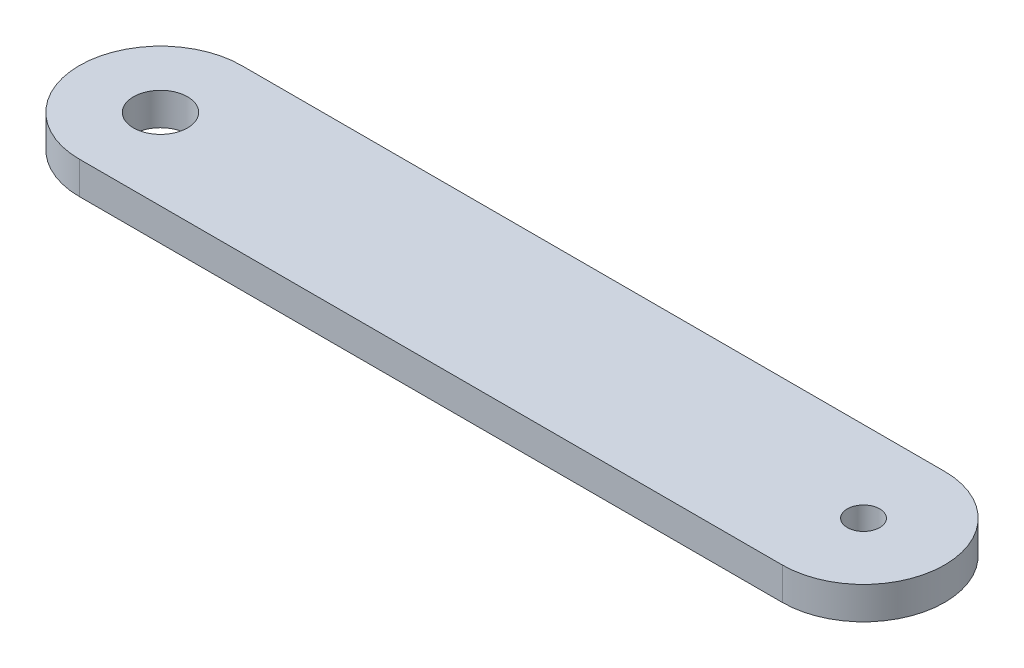
ISO-10303-21;
HEADER;
FILE_DESCRIPTION(('STEP AP214'),'2;1');
FILE_NAME('part.step','',(''),(''),'','','');
FILE_SCHEMA(('AUTOMOTIVE_DESIGN { 1 0 10303 214 1 1 1 1 }'));
ENDSEC;
DATA;
#1=APPLICATION_CONTEXT('core data for automotive mechanical design processes');
#2=APPLICATION_PROTOCOL_DEFINITION('international standard','automotive_design',2000,#1);
#3=PRODUCT_CONTEXT('',#1,'mechanical');
#4=PRODUCT('Part','Part','',(#3));
#5=PRODUCT_RELATED_PRODUCT_CATEGORY('part','',(#4));
#6=PRODUCT_DEFINITION_FORMATION('','',#4);
#7=PRODUCT_DEFINITION_CONTEXT('part definition',#1,'design');
#8=PRODUCT_DEFINITION('design','',#6,#7);
#9=PRODUCT_DEFINITION_SHAPE('','',#8);
#10=(LENGTH_UNIT() NAMED_UNIT(*) SI_UNIT(.MILLI.,.METRE.));
#11=(NAMED_UNIT(*) PLANE_ANGLE_UNIT() SI_UNIT($,.RADIAN.));
#12=(NAMED_UNIT(*) SI_UNIT($,.STERADIAN.) SOLID_ANGLE_UNIT());
#13=UNCERTAINTY_MEASURE_WITH_UNIT(LENGTH_MEASURE(1.E-05),#10,'distance_accuracy_value','');
#14=(GEOMETRIC_REPRESENTATION_CONTEXT(3) GLOBAL_UNCERTAINTY_ASSIGNED_CONTEXT((#13)) GLOBAL_UNIT_ASSIGNED_CONTEXT((#10,
#11,#12)) REPRESENTATION_CONTEXT('',''));
#15=CARTESIAN_POINT('',(0.,0.,0.));
#16=DIRECTION('',(0.,0.,1.));
#17=DIRECTION('',(1.,0.,0.));
#18=AXIS2_PLACEMENT_3D('',#15,#16,#17);
#19=CARTESIAN_POINT('',(123.5,6.,-13.5000000000001));
#20=DIRECTION('',(0.,1.,0.));
#21=DIRECTION('',(0.,0.,1.));
#22=AXIS2_PLACEMENT_3D('',#19,#20,#21);
#23=PLANE('',#22);
#24=CARTESIAN_POINT('',(-6.50000000000001,6.,-13.5));
#25=DIRECTION('',(0.,1.,0.));
#26=DIRECTION('',(0.,0.,1.));
#27=AXIS2_PLACEMENT_3D('',#24,#25,#26);
#28=CIRCLE('',#27,5.);
#29=CARTESIAN_POINT('',(-6.50000000000001,6.,-8.5));
#30=VERTEX_POINT('',#29);
#31=EDGE_CURVE('E112',#30,#30,#28,.T.);
#32=ORIENTED_EDGE('',*,*,#31,.F.);
#33=EDGE_LOOP('',(#32));
#34=FACE_BOUND('',#33,.T.);
#35=CARTESIAN_POINT('',(123.5,6.,-13.5000000000001));
#36=DIRECTION('',(0.,1.,0.));
#37=DIRECTION('',(0.,0.,1.));
#38=AXIS2_PLACEMENT_3D('',#35,#36,#37);
#39=CIRCLE('',#38,15.);
#40=CARTESIAN_POINT('',(123.5,6.,1.49999999999992));
#41=VERTEX_POINT('',#40);
#42=CARTESIAN_POINT('',(123.5,6.,-28.5000000000001));
#43=VERTEX_POINT('',#42);
#44=EDGE_CURVE('E92',#41,#43,#39,.T.);
#45=ORIENTED_EDGE('',*,*,#44,.T.);
#46=DIRECTION('',(-1.,0.,0.));
#47=VECTOR('',#46,1.);
#48=CARTESIAN_POINT('',(-6.50000000000001,6.,-28.5));
#49=LINE('',#48,#47);
#50=CARTESIAN_POINT('',(-6.50000000000001,6.,-28.5));
#51=VERTEX_POINT('',#50);
#52=EDGE_CURVE('E87',#43,#51,#49,.T.);
#53=ORIENTED_EDGE('',*,*,#52,.T.);
#54=CARTESIAN_POINT('',(-6.50000000000001,6.,-13.5));
#55=DIRECTION('',(0.,1.,0.));
#56=DIRECTION('',(0.,0.,1.));
#57=AXIS2_PLACEMENT_3D('',#54,#55,#56);
#58=CIRCLE('',#57,15.);
#59=CARTESIAN_POINT('',(-6.5,6.,1.5));
#60=VERTEX_POINT('',#59);
#61=EDGE_CURVE('E90',#51,#60,#58,.T.);
#62=ORIENTED_EDGE('',*,*,#61,.T.);
#63=DIRECTION('',(1.,0.,0.));
#64=VECTOR('',#63,1.);
#65=CARTESIAN_POINT('',(-6.5,6.,1.5));
#66=LINE('',#65,#64);
#67=EDGE_CURVE('E57',#60,#41,#66,.T.);
#68=ORIENTED_EDGE('',*,*,#67,.T.);
#69=EDGE_LOOP('',(#45,#53,#62,#68));
#70=FACE_BOUND('',#69,.T.);
#71=CARTESIAN_POINT('',(123.5,6.,-13.5000000000001));
#72=DIRECTION('',(0.,1.,0.));
#73=DIRECTION('',(0.,0.,1.));
#74=AXIS2_PLACEMENT_3D('',#71,#72,#73);
#75=CIRCLE('',#74,2.99999999999998);
#76=CARTESIAN_POINT('',(123.5,6.,-10.5000000000001));
#77=VERTEX_POINT('',#76);
#78=EDGE_CURVE('E134',#77,#77,#75,.T.);
#79=ORIENTED_EDGE('',*,*,#78,.F.);
#80=EDGE_LOOP('',(#79));
#81=FACE_BOUND('',#80,.T.);
#82=ADVANCED_FACE('F39',(#34,#70,#81),#23,.T.);
#83=CARTESIAN_POINT('',(123.5,0.,-13.5000000000001));
#84=DIRECTION('',(0.,1.,0.));
#85=DIRECTION('',(0.,0.,1.));
#86=AXIS2_PLACEMENT_3D('',#83,#84,#85);
#87=PLANE('',#86);
#88=CARTESIAN_POINT('',(123.5,0.,-13.5000000000001));
#89=DIRECTION('',(0.,1.,0.));
#90=DIRECTION('',(0.,0.,1.));
#91=AXIS2_PLACEMENT_3D('',#88,#89,#90);
#92=CIRCLE('',#91,15.);
#93=CARTESIAN_POINT('',(123.5,0.,1.49999999999992));
#94=VERTEX_POINT('',#93);
#95=CARTESIAN_POINT('',(123.5,0.,-28.5000000000001));
#96=VERTEX_POINT('',#95);
#97=EDGE_CURVE('E108',#94,#96,#92,.T.);
#98=ORIENTED_EDGE('',*,*,#97,.F.);
#99=DIRECTION('',(1.,0.,0.));
#100=VECTOR('',#99,1.);
#101=CARTESIAN_POINT('',(-6.5,0.,1.5));
#102=LINE('',#101,#100);
#103=CARTESIAN_POINT('',(-6.5,0.,1.5));
#104=VERTEX_POINT('',#103);
#105=EDGE_CURVE('E80',#104,#94,#102,.T.);
#106=ORIENTED_EDGE('',*,*,#105,.F.);
#107=CARTESIAN_POINT('',(-6.50000000000001,0.,-13.5));
#108=DIRECTION('',(0.,1.,0.));
#109=DIRECTION('',(0.,0.,1.));
#110=AXIS2_PLACEMENT_3D('',#107,#108,#109);
#111=CIRCLE('',#110,15.);
#112=CARTESIAN_POINT('',(-6.50000000000001,0.,-28.5));
#113=VERTEX_POINT('',#112);
#114=EDGE_CURVE('E74',#113,#104,#111,.T.);
#115=ORIENTED_EDGE('',*,*,#114,.F.);
#116=DIRECTION('',(-1.,0.,0.));
#117=VECTOR('',#116,1.);
#118=CARTESIAN_POINT('',(-6.50000000000001,0.,-28.5));
#119=LINE('',#118,#117);
#120=EDGE_CURVE('E97',#96,#113,#119,.T.);
#121=ORIENTED_EDGE('',*,*,#120,.F.);
#122=EDGE_LOOP('',(#98,#106,#115,#121));
#123=FACE_BOUND('',#122,.T.);
#124=CARTESIAN_POINT('',(-6.50000000000001,0.,-13.5));
#125=DIRECTION('',(0.,1.,0.));
#126=DIRECTION('',(0.,0.,1.));
#127=AXIS2_PLACEMENT_3D('',#124,#125,#126);
#128=CIRCLE('',#127,5.);
#129=CARTESIAN_POINT('',(-6.50000000000001,0.,-8.5));
#130=VERTEX_POINT('',#129);
#131=EDGE_CURVE('E130',#130,#130,#128,.T.);
#132=ORIENTED_EDGE('',*,*,#131,.T.);
#133=EDGE_LOOP('',(#132));
#134=FACE_BOUND('',#133,.T.);
#135=CARTESIAN_POINT('',(123.5,0.,-13.5000000000001));
#136=DIRECTION('',(0.,1.,0.));
#137=DIRECTION('',(0.,0.,1.));
#138=AXIS2_PLACEMENT_3D('',#135,#136,#137);
#139=CIRCLE('',#138,2.99999999999998);
#140=CARTESIAN_POINT('',(123.5,0.,-10.5000000000001));
#141=VERTEX_POINT('',#140);
#142=EDGE_CURVE('E138',#141,#141,#139,.T.);
#143=ORIENTED_EDGE('',*,*,#142,.T.);
#144=EDGE_LOOP('',(#143));
#145=FACE_BOUND('',#144,.T.);
#146=ADVANCED_FACE('F125',(#123,#134,#145),#87,.F.);
#147=CARTESIAN_POINT('',(123.5,6.,-13.5000000000001));
#148=DIRECTION('',(0.,-1.,0.));
#149=DIRECTION('',(0.,0.,-1.));
#150=AXIS2_PLACEMENT_3D('',#147,#148,#149);
#151=CYLINDRICAL_SURFACE('',#150,15.);
#152=ORIENTED_EDGE('',*,*,#97,.T.);
#153=DIRECTION('',(0.,-1.,0.));
#154=VECTOR('',#153,1.);
#155=CARTESIAN_POINT('',(123.5,6.,-28.5000000000001));
#156=LINE('',#155,#154);
#157=EDGE_CURVE('E11',#43,#96,#156,.T.);
#158=ORIENTED_EDGE('',*,*,#157,.F.);
#159=ORIENTED_EDGE('',*,*,#44,.F.);
#160=DIRECTION('',(0.,-1.,0.));
#161=VECTOR('',#160,1.);
#162=CARTESIAN_POINT('',(123.5,6.,1.49999999999992));
#163=LINE('',#162,#161);
#164=EDGE_CURVE('E104',#41,#94,#163,.T.);
#165=ORIENTED_EDGE('',*,*,#164,.T.);
#166=EDGE_LOOP('',(#152,#158,#159,#165));
#167=FACE_BOUND('',#166,.T.);
#168=ADVANCED_FACE('F41',(#167),#151,.T.);
#169=CARTESIAN_POINT('',(-6.50000000000001,6.,-28.5));
#170=DIRECTION('',(0.,0.,1.));
#171=DIRECTION('',(1.,0.,0.));
#172=AXIS2_PLACEMENT_3D('',#169,#170,#171);
#173=PLANE('',#172);
#174=ORIENTED_EDGE('',*,*,#120,.T.);
#175=DIRECTION('',(0.,-1.,0.));
#176=VECTOR('',#175,1.);
#177=CARTESIAN_POINT('',(-6.50000000000001,6.,-28.5));
#178=LINE('',#177,#176);
#179=EDGE_CURVE('E49',#51,#113,#178,.T.);
#180=ORIENTED_EDGE('',*,*,#179,.F.);
#181=ORIENTED_EDGE('',*,*,#52,.F.);
#182=ORIENTED_EDGE('',*,*,#157,.T.);
#183=EDGE_LOOP('',(#174,#180,#181,#182));
#184=FACE_BOUND('',#183,.T.);
#185=ADVANCED_FACE('F96',(#184),#173,.F.);
#186=CARTESIAN_POINT('',(-6.50000000000001,6.,-13.5));
#187=DIRECTION('',(0.,-1.,0.));
#188=DIRECTION('',(0.,0.,-1.));
#189=AXIS2_PLACEMENT_3D('',#186,#187,#188);
#190=CYLINDRICAL_SURFACE('',#189,15.);
#191=ORIENTED_EDGE('',*,*,#114,.T.);
#192=DIRECTION('',(0.,-1.,0.));
#193=VECTOR('',#192,1.);
#194=CARTESIAN_POINT('',(-6.5,6.,1.5));
#195=LINE('',#194,#193);
#196=EDGE_CURVE('E99',#60,#104,#195,.T.);
#197=ORIENTED_EDGE('',*,*,#196,.F.);
#198=ORIENTED_EDGE('',*,*,#61,.F.);
#199=ORIENTED_EDGE('',*,*,#179,.T.);
#200=EDGE_LOOP('',(#191,#197,#198,#199));
#201=FACE_BOUND('',#200,.T.);
#202=ADVANCED_FACE('F100',(#201),#190,.T.);
#203=CARTESIAN_POINT('',(-6.5,6.,1.5));
#204=DIRECTION('',(0.,0.,-1.));
#205=DIRECTION('',(-1.,0.,0.));
#206=AXIS2_PLACEMENT_3D('',#203,#204,#205);
#207=PLANE('',#206);
#208=ORIENTED_EDGE('',*,*,#105,.T.);
#209=ORIENTED_EDGE('',*,*,#164,.F.);
#210=ORIENTED_EDGE('',*,*,#67,.F.);
#211=ORIENTED_EDGE('',*,*,#196,.T.);
#212=EDGE_LOOP('',(#208,#209,#210,#211));
#213=FACE_BOUND('',#212,.T.);
#214=ADVANCED_FACE('F122',(#213),#207,.F.);
#215=CARTESIAN_POINT('',(-6.50000000000001,6.,-13.5));
#216=DIRECTION('',(0.,-1.,0.));
#217=DIRECTION('',(0.,0.,-1.));
#218=AXIS2_PLACEMENT_3D('',#215,#216,#217);
#219=CYLINDRICAL_SURFACE('',#218,5.);
#220=ORIENTED_EDGE('',*,*,#31,.T.);
#221=EDGE_LOOP('',(#220));
#222=FACE_BOUND('',#221,.T.);
#223=ORIENTED_EDGE('',*,*,#131,.F.);
#224=EDGE_LOOP('',(#223));
#225=FACE_BOUND('',#224,.T.);
#226=ADVANCED_FACE('F157',(#222,#225),#219,.F.);
#227=CARTESIAN_POINT('',(123.5,6.,-13.5000000000001));
#228=DIRECTION('',(0.,-1.,0.));
#229=DIRECTION('',(0.,0.,-1.));
#230=AXIS2_PLACEMENT_3D('',#227,#228,#229);
#231=CYLINDRICAL_SURFACE('',#230,2.99999999999998);
#232=ORIENTED_EDGE('',*,*,#78,.T.);
#233=EDGE_LOOP('',(#232));
#234=FACE_BOUND('',#233,.T.);
#235=ORIENTED_EDGE('',*,*,#142,.F.);
#236=EDGE_LOOP('',(#235));
#237=FACE_BOUND('',#236,.T.);
#238=ADVANCED_FACE('F146',(#234,#237),#231,.F.);
#239=CLOSED_SHELL('',(#82,#146,#168,#185,#202,#214,#226,#238));
#240=MANIFOLD_SOLID_BREP('B2',#239);
#241=ADVANCED_BREP_SHAPE_REPRESENTATION('',(#18,#240),#14);
#242=SHAPE_DEFINITION_REPRESENTATION(#9,#241);
ENDSEC;
END-ISO-10303-21;
